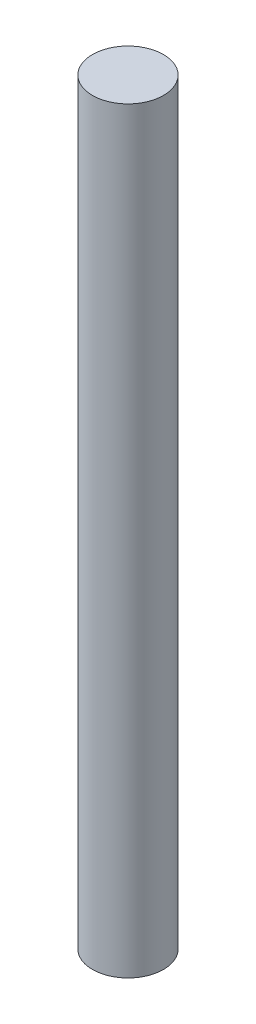
ISO-10303-21;
HEADER;
FILE_DESCRIPTION(('STEP AP214'),'2;1');
FILE_NAME('part.step','',(''),(''),'','','');
FILE_SCHEMA(('AUTOMOTIVE_DESIGN { 1 0 10303 214 1 1 1 1 }'));
ENDSEC;
DATA;
#1=APPLICATION_CONTEXT('core data for automotive mechanical design processes');
#2=APPLICATION_PROTOCOL_DEFINITION('international standard','automotive_design',2000,#1);
#3=PRODUCT_CONTEXT('',#1,'mechanical');
#4=PRODUCT('Part','Part','',(#3));
#5=PRODUCT_RELATED_PRODUCT_CATEGORY('part','',(#4));
#6=PRODUCT_DEFINITION_FORMATION('','',#4);
#7=PRODUCT_DEFINITION_CONTEXT('part definition',#1,'design');
#8=PRODUCT_DEFINITION('design','',#6,#7);
#9=PRODUCT_DEFINITION_SHAPE('','',#8);
#10=(LENGTH_UNIT() NAMED_UNIT(*) SI_UNIT(.MILLI.,.METRE.));
#11=(NAMED_UNIT(*) PLANE_ANGLE_UNIT() SI_UNIT($,.RADIAN.));
#12=(NAMED_UNIT(*) SI_UNIT($,.STERADIAN.) SOLID_ANGLE_UNIT());
#13=UNCERTAINTY_MEASURE_WITH_UNIT(LENGTH_MEASURE(1.E-05),#10,'distance_accuracy_value','');
#14=(GEOMETRIC_REPRESENTATION_CONTEXT(3) GLOBAL_UNCERTAINTY_ASSIGNED_CONTEXT((#13)) GLOBAL_UNIT_ASSIGNED_CONTEXT((#10,
#11,#12)) REPRESENTATION_CONTEXT('',''));
#15=CARTESIAN_POINT('',(0.,0.,0.));
#16=DIRECTION('',(0.,0.,1.));
#17=DIRECTION('',(1.,0.,0.));
#18=AXIS2_PLACEMENT_3D('',#15,#16,#17);
#19=CARTESIAN_POINT('',(0.,64.,0.));
#20=DIRECTION('',(0.,-1.,0.));
#21=DIRECTION('',(0.,0.,-1.));
#22=AXIS2_PLACEMENT_3D('',#19,#20,#21);
#23=CYLINDRICAL_SURFACE('',#22,3.);
#24=CARTESIAN_POINT('',(0.,64.,0.));
#25=DIRECTION('',(0.,1.,0.));
#26=DIRECTION('',(0.,0.,1.));
#27=AXIS2_PLACEMENT_3D('',#24,#25,#26);
#28=CIRCLE('',#27,3.);
#29=CARTESIAN_POINT('',(0.,64.,3.));
#30=VERTEX_POINT('',#29);
#31=EDGE_CURVE('E10',#30,#30,#28,.T.);
#32=ORIENTED_EDGE('',*,*,#31,.F.);
#33=EDGE_LOOP('',(#32));
#34=FACE_BOUND('',#33,.T.);
#35=CARTESIAN_POINT('',(0.,0.,0.));
#36=DIRECTION('',(0.,1.,0.));
#37=DIRECTION('',(0.,0.,1.));
#38=AXIS2_PLACEMENT_3D('',#35,#36,#37);
#39=CIRCLE('',#38,3.);
#40=CARTESIAN_POINT('',(0.,0.,3.));
#41=VERTEX_POINT('',#40);
#42=EDGE_CURVE('E34',#41,#41,#39,.T.);
#43=ORIENTED_EDGE('',*,*,#42,.T.);
#44=EDGE_LOOP('',(#43));
#45=FACE_BOUND('',#44,.T.);
#46=ADVANCED_FACE('F31',(#34,#45),#23,.T.);
#47=CARTESIAN_POINT('',(0.,64.,0.));
#48=DIRECTION('',(0.,1.,0.));
#49=DIRECTION('',(0.,0.,1.));
#50=AXIS2_PLACEMENT_3D('',#47,#48,#49);
#51=PLANE('',#50);
#52=ORIENTED_EDGE('',*,*,#31,.T.);
#53=EDGE_LOOP('',(#52));
#54=FACE_BOUND('',#53,.T.);
#55=ADVANCED_FACE('F46',(#54),#51,.T.);
#56=CARTESIAN_POINT('',(0.,0.,0.));
#57=DIRECTION('',(0.,1.,0.));
#58=DIRECTION('',(0.,0.,1.));
#59=AXIS2_PLACEMENT_3D('',#56,#57,#58);
#60=PLANE('',#59);
#61=ORIENTED_EDGE('',*,*,#42,.F.);
#62=EDGE_LOOP('',(#61));
#63=FACE_BOUND('',#62,.T.);
#64=ADVANCED_FACE('F44',(#63),#60,.F.);
#65=CLOSED_SHELL('',(#46,#55,#64));
#66=MANIFOLD_SOLID_BREP('B2',#65);
#67=ADVANCED_BREP_SHAPE_REPRESENTATION('',(#18,#66),#14);
#68=SHAPE_DEFINITION_REPRESENTATION(#9,#67);
ENDSEC;
END-ISO-10303-21;
